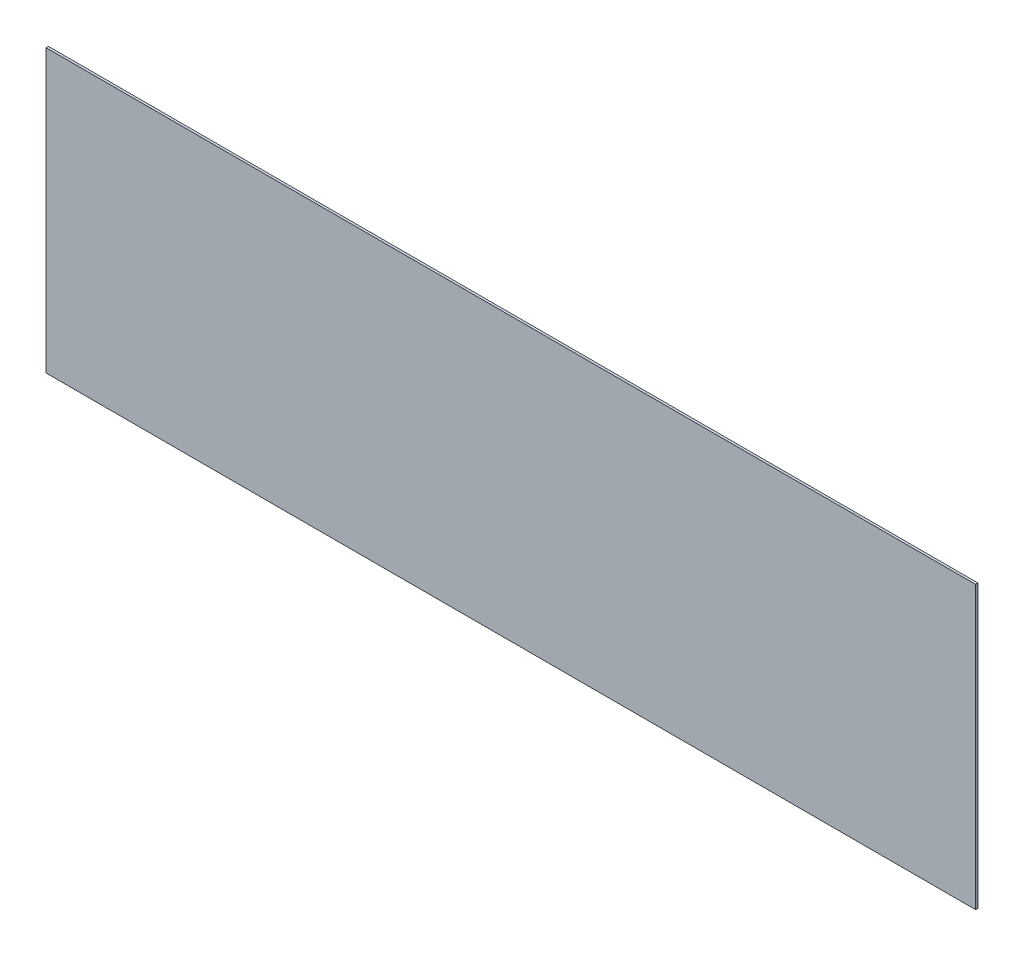
ISO-10303-21;
HEADER;
FILE_DESCRIPTION(('STEP AP214'),'2;1');
FILE_NAME('part.step','',(''),(''),'','','');
FILE_SCHEMA(('AUTOMOTIVE_DESIGN { 1 0 10303 214 1 1 1 1 }'));
ENDSEC;
DATA;
#1=APPLICATION_CONTEXT('core data for automotive mechanical design processes');
#2=APPLICATION_PROTOCOL_DEFINITION('international standard','automotive_design',2000,#1);
#3=PRODUCT_CONTEXT('',#1,'mechanical');
#4=PRODUCT('Part','Part','',(#3));
#5=PRODUCT_RELATED_PRODUCT_CATEGORY('part','',(#4));
#6=PRODUCT_DEFINITION_FORMATION('','',#4);
#7=PRODUCT_DEFINITION_CONTEXT('part definition',#1,'design');
#8=PRODUCT_DEFINITION('design','',#6,#7);
#9=PRODUCT_DEFINITION_SHAPE('','',#8);
#10=(LENGTH_UNIT() NAMED_UNIT(*) SI_UNIT(.MILLI.,.METRE.));
#11=(NAMED_UNIT(*) PLANE_ANGLE_UNIT() SI_UNIT($,.RADIAN.));
#12=(NAMED_UNIT(*) SI_UNIT($,.STERADIAN.) SOLID_ANGLE_UNIT());
#13=UNCERTAINTY_MEASURE_WITH_UNIT(LENGTH_MEASURE(1.E-05),#10,'distance_accuracy_value','');
#14=(GEOMETRIC_REPRESENTATION_CONTEXT(3) GLOBAL_UNCERTAINTY_ASSIGNED_CONTEXT((#13)) GLOBAL_UNIT_ASSIGNED_CONTEXT((#10,
#11,#12)) REPRESENTATION_CONTEXT('',''));
#15=CARTESIAN_POINT('',(0.,0.,0.));
#16=DIRECTION('',(0.,0.,1.));
#17=DIRECTION('',(1.,0.,0.));
#18=AXIS2_PLACEMENT_3D('',#15,#16,#17);
#19=CARTESIAN_POINT('',(-116.643449080716,-135.952553925732,1.5));
#20=DIRECTION('',(1.,0.,0.));
#21=DIRECTION('',(0.,1.,0.));
#22=AXIS2_PLACEMENT_3D('',#19,#20,#21);
#23=PLANE('',#22);
#24=DIRECTION('',(0.,-1.,0.));
#25=VECTOR('',#24,1.);
#26=CARTESIAN_POINT('',(-116.643449080716,-135.952553925732,0.));
#27=LINE('',#26,#25);
#28=CARTESIAN_POINT('',(-116.643449080716,41.4474460742681,0.));
#29=VERTEX_POINT('',#28);
#30=CARTESIAN_POINT('',(-116.643449080716,-135.952553925732,0.));
#31=VERTEX_POINT('',#30);
#32=EDGE_CURVE('E96',#29,#31,#27,.T.);
#33=ORIENTED_EDGE('',*,*,#32,.T.);
#34=DIRECTION('',(0.,0.,-1.));
#35=VECTOR('',#34,1.);
#36=CARTESIAN_POINT('',(-116.643449080716,-135.952553925732,1.5));
#37=LINE('',#36,#35);
#38=CARTESIAN_POINT('',(-116.643449080716,-135.952553925732,1.5));
#39=VERTEX_POINT('',#38);
#40=EDGE_CURVE('E11',#39,#31,#37,.T.);
#41=ORIENTED_EDGE('',*,*,#40,.F.);
#42=DIRECTION('',(0.,-1.,0.));
#43=VECTOR('',#42,1.);
#44=CARTESIAN_POINT('',(-116.643449080716,-135.952553925732,1.5));
#45=LINE('',#44,#43);
#46=CARTESIAN_POINT('',(-116.643449080716,41.4474460742681,1.5));
#47=VERTEX_POINT('',#46);
#48=EDGE_CURVE('E84',#47,#39,#45,.T.);
#49=ORIENTED_EDGE('',*,*,#48,.F.);
#50=DIRECTION('',(0.,0.,-1.));
#51=VECTOR('',#50,1.);
#52=CARTESIAN_POINT('',(-116.643449080716,41.4474460742681,1.5));
#53=LINE('',#52,#51);
#54=EDGE_CURVE('E92',#47,#29,#53,.T.);
#55=ORIENTED_EDGE('',*,*,#54,.T.);
#56=EDGE_LOOP('',(#33,#41,#49,#55));
#57=FACE_BOUND('',#56,.T.);
#58=ADVANCED_FACE('F33',(#57),#23,.F.);
#59=CARTESIAN_POINT('',(468.756550919284,-135.952553925732,1.5));
#60=DIRECTION('',(0.,1.,0.));
#61=DIRECTION('',(-1.,0.,0.));
#62=AXIS2_PLACEMENT_3D('',#59,#60,#61);
#63=PLANE('',#62);
#64=DIRECTION('',(1.,0.,0.));
#65=VECTOR('',#64,1.);
#66=CARTESIAN_POINT('',(468.756550919284,-135.952553925732,0.));
#67=LINE('',#66,#65);
#68=CARTESIAN_POINT('',(468.756550919284,-135.952553925732,0.));
#69=VERTEX_POINT('',#68);
#70=EDGE_CURVE('E88',#31,#69,#67,.T.);
#71=ORIENTED_EDGE('',*,*,#70,.T.);
#72=DIRECTION('',(0.,0.,-1.));
#73=VECTOR('',#72,1.);
#74=CARTESIAN_POINT('',(468.756550919284,-135.952553925732,1.5));
#75=LINE('',#74,#73);
#76=CARTESIAN_POINT('',(468.756550919284,-135.952553925732,1.5));
#77=VERTEX_POINT('',#76);
#78=EDGE_CURVE('E41',#77,#69,#75,.T.);
#79=ORIENTED_EDGE('',*,*,#78,.F.);
#80=DIRECTION('',(1.,0.,0.));
#81=VECTOR('',#80,1.);
#82=CARTESIAN_POINT('',(468.756550919284,-135.952553925732,1.5));
#83=LINE('',#82,#81);
#84=EDGE_CURVE('E79',#39,#77,#83,.T.);
#85=ORIENTED_EDGE('',*,*,#84,.F.);
#86=ORIENTED_EDGE('',*,*,#40,.T.);
#87=EDGE_LOOP('',(#71,#79,#85,#86));
#88=FACE_BOUND('',#87,.T.);
#89=ADVANCED_FACE('F87',(#88),#63,.F.);
#90=CARTESIAN_POINT('',(468.756550919284,-135.952553925732,1.5));
#91=DIRECTION('',(-1.,0.,0.));
#92=DIRECTION('',(0.,0.,1.));
#93=AXIS2_PLACEMENT_3D('',#90,#91,#92);
#94=PLANE('',#93);
#95=DIRECTION('',(0.,1.,0.));
#96=VECTOR('',#95,1.);
#97=CARTESIAN_POINT('',(468.756550919284,-135.952553925732,0.));
#98=LINE('',#97,#96);
#99=CARTESIAN_POINT('',(468.756550919284,41.4474460742681,0.));
#100=VERTEX_POINT('',#99);
#101=EDGE_CURVE('E66',#69,#100,#98,.T.);
#102=ORIENTED_EDGE('',*,*,#101,.T.);
#103=DIRECTION('',(0.,0.,-1.));
#104=VECTOR('',#103,1.);
#105=CARTESIAN_POINT('',(468.756550919284,41.4474460742681,1.5));
#106=LINE('',#105,#104);
#107=CARTESIAN_POINT('',(468.756550919284,41.4474460742681,1.5));
#108=VERTEX_POINT('',#107);
#109=EDGE_CURVE('E89',#108,#100,#106,.T.);
#110=ORIENTED_EDGE('',*,*,#109,.F.);
#111=DIRECTION('',(0.,1.,0.));
#112=VECTOR('',#111,1.);
#113=CARTESIAN_POINT('',(468.756550919284,-135.952553925732,1.5));
#114=LINE('',#113,#112);
#115=EDGE_CURVE('E82',#77,#108,#114,.T.);
#116=ORIENTED_EDGE('',*,*,#115,.F.);
#117=ORIENTED_EDGE('',*,*,#78,.T.);
#118=EDGE_LOOP('',(#102,#110,#116,#117));
#119=FACE_BOUND('',#118,.T.);
#120=ADVANCED_FACE('F90',(#119),#94,.F.);
#121=CARTESIAN_POINT('',(468.756550919284,41.4474460742681,1.5));
#122=DIRECTION('',(0.,-1.,0.));
#123=DIRECTION('',(1.,0.,0.));
#124=AXIS2_PLACEMENT_3D('',#121,#122,#123);
#125=PLANE('',#124);
#126=DIRECTION('',(-1.,0.,0.));
#127=VECTOR('',#126,1.);
#128=CARTESIAN_POINT('',(468.756550919284,41.4474460742681,0.));
#129=LINE('',#128,#127);
#130=EDGE_CURVE('E72',#100,#29,#129,.T.);
#131=ORIENTED_EDGE('',*,*,#130,.T.);
#132=ORIENTED_EDGE('',*,*,#54,.F.);
#133=DIRECTION('',(-1.,0.,0.));
#134=VECTOR('',#133,1.);
#135=CARTESIAN_POINT('',(468.756550919284,41.4474460742681,1.5));
#136=LINE('',#135,#134);
#137=EDGE_CURVE('E49',#108,#47,#136,.T.);
#138=ORIENTED_EDGE('',*,*,#137,.F.);
#139=ORIENTED_EDGE('',*,*,#109,.T.);
#140=EDGE_LOOP('',(#131,#132,#138,#139));
#141=FACE_BOUND('',#140,.T.);
#142=ADVANCED_FACE('F103',(#141),#125,.F.);
#143=CARTESIAN_POINT('',(0.,0.,1.5));
#144=DIRECTION('',(0.,0.,1.));
#145=DIRECTION('',(1.,0.,0.));
#146=AXIS2_PLACEMENT_3D('',#143,#144,#145);
#147=PLANE('',#146);
#148=ORIENTED_EDGE('',*,*,#48,.T.);
#149=ORIENTED_EDGE('',*,*,#84,.T.);
#150=ORIENTED_EDGE('',*,*,#115,.T.);
#151=ORIENTED_EDGE('',*,*,#137,.T.);
#152=EDGE_LOOP('',(#148,#149,#150,#151));
#153=FACE_BOUND('',#152,.T.);
#154=ADVANCED_FACE('F80',(#153),#147,.T.);
#155=CARTESIAN_POINT('',(0.,0.,0.));
#156=DIRECTION('',(0.,0.,1.));
#157=DIRECTION('',(1.,0.,0.));
#158=AXIS2_PLACEMENT_3D('',#155,#156,#157);
#159=PLANE('',#158);
#160=ORIENTED_EDGE('',*,*,#32,.F.);
#161=ORIENTED_EDGE('',*,*,#130,.F.);
#162=ORIENTED_EDGE('',*,*,#101,.F.);
#163=ORIENTED_EDGE('',*,*,#70,.F.);
#164=EDGE_LOOP('',(#160,#161,#162,#163));
#165=FACE_BOUND('',#164,.T.);
#166=ADVANCED_FACE('F106',(#165),#159,.F.);
#167=CLOSED_SHELL('',(#58,#89,#120,#142,#154,#166));
#168=MANIFOLD_SOLID_BREP('B2',#167);
#169=ADVANCED_BREP_SHAPE_REPRESENTATION('',(#18,#168),#14);
#170=SHAPE_DEFINITION_REPRESENTATION(#9,#169);
ENDSEC;
END-ISO-10303-21;
